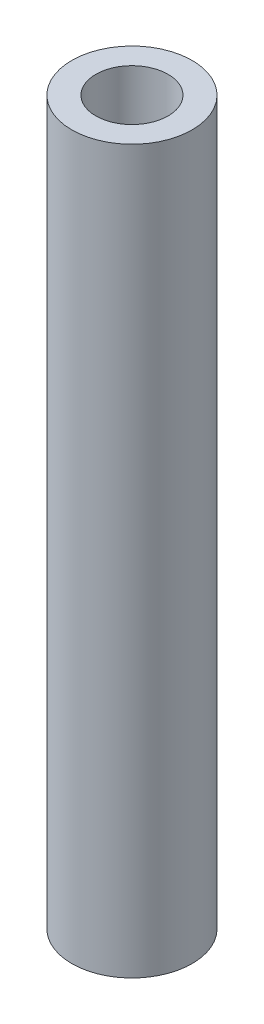
ISO-10303-21;
HEADER;
FILE_DESCRIPTION(('STEP AP214'),'2;1');
FILE_NAME('part.step','',(''),(''),'','','');
FILE_SCHEMA(('AUTOMOTIVE_DESIGN { 1 0 10303 214 1 1 1 1 }'));
ENDSEC;
DATA;
#1=APPLICATION_CONTEXT('core data for automotive mechanical design processes');
#2=APPLICATION_PROTOCOL_DEFINITION('international standard','automotive_design',2000,#1);
#3=PRODUCT_CONTEXT('',#1,'mechanical');
#4=PRODUCT('Part','Part','',(#3));
#5=PRODUCT_RELATED_PRODUCT_CATEGORY('part','',(#4));
#6=PRODUCT_DEFINITION_FORMATION('','',#4);
#7=PRODUCT_DEFINITION_CONTEXT('part definition',#1,'design');
#8=PRODUCT_DEFINITION('design','',#6,#7);
#9=PRODUCT_DEFINITION_SHAPE('','',#8);
#10=(LENGTH_UNIT() NAMED_UNIT(*) SI_UNIT(.MILLI.,.METRE.));
#11=(NAMED_UNIT(*) PLANE_ANGLE_UNIT() SI_UNIT($,.RADIAN.));
#12=(NAMED_UNIT(*) SI_UNIT($,.STERADIAN.) SOLID_ANGLE_UNIT());
#13=UNCERTAINTY_MEASURE_WITH_UNIT(LENGTH_MEASURE(1.E-05),#10,'distance_accuracy_value','');
#14=(GEOMETRIC_REPRESENTATION_CONTEXT(3) GLOBAL_UNCERTAINTY_ASSIGNED_CONTEXT((#13)) GLOBAL_UNIT_ASSIGNED_CONTEXT((#10,
#11,#12)) REPRESENTATION_CONTEXT('',''));
#15=CARTESIAN_POINT('',(0.,0.,0.));
#16=DIRECTION('',(0.,0.,1.));
#17=DIRECTION('',(1.,0.,0.));
#18=AXIS2_PLACEMENT_3D('',#15,#16,#17);
#19=CARTESIAN_POINT('',(0.,30.,0.));
#20=DIRECTION('',(0.,1.,0.));
#21=DIRECTION('',(0.,0.,1.));
#22=AXIS2_PLACEMENT_3D('',#19,#20,#21);
#23=PLANE('',#22);
#24=CARTESIAN_POINT('',(0.,30.,0.));
#25=DIRECTION('',(0.,1.,0.));
#26=DIRECTION('',(0.,0.,1.));
#27=AXIS2_PLACEMENT_3D('',#24,#25,#26);
#28=CIRCLE('',#27,2.5);
#29=CARTESIAN_POINT('',(0.,30.,2.5));
#30=VERTEX_POINT('',#29);
#31=EDGE_CURVE('E10',#30,#30,#28,.T.);
#32=ORIENTED_EDGE('',*,*,#31,.T.);
#33=EDGE_LOOP('',(#32));
#34=FACE_BOUND('',#33,.T.);
#35=CARTESIAN_POINT('',(0.,30.,0.));
#36=DIRECTION('',(0.,1.,0.));
#37=DIRECTION('',(0.,0.,1.));
#38=AXIS2_PLACEMENT_3D('',#35,#36,#37);
#39=CIRCLE('',#38,1.5);
#40=CARTESIAN_POINT('',(0.,30.,1.5));
#41=VERTEX_POINT('',#40);
#42=EDGE_CURVE('E43',#41,#41,#39,.T.);
#43=ORIENTED_EDGE('',*,*,#42,.F.);
#44=EDGE_LOOP('',(#43));
#45=FACE_BOUND('',#44,.T.);
#46=ADVANCED_FACE('F32',(#34,#45),#23,.T.);
#47=CARTESIAN_POINT('',(0.,0.,0.));
#48=DIRECTION('',(0.,1.,0.));
#49=DIRECTION('',(0.,0.,1.));
#50=AXIS2_PLACEMENT_3D('',#47,#48,#49);
#51=PLANE('',#50);
#52=CARTESIAN_POINT('',(0.,0.,0.));
#53=DIRECTION('',(0.,1.,0.));
#54=DIRECTION('',(0.,0.,1.));
#55=AXIS2_PLACEMENT_3D('',#52,#53,#54);
#56=CIRCLE('',#55,2.5);
#57=CARTESIAN_POINT('',(0.,0.,2.5));
#58=VERTEX_POINT('',#57);
#59=EDGE_CURVE('E36',#58,#58,#56,.T.);
#60=ORIENTED_EDGE('',*,*,#59,.F.);
#61=EDGE_LOOP('',(#60));
#62=FACE_BOUND('',#61,.T.);
#63=CARTESIAN_POINT('',(0.,0.,0.));
#64=DIRECTION('',(0.,1.,0.));
#65=DIRECTION('',(0.,0.,1.));
#66=AXIS2_PLACEMENT_3D('',#63,#64,#65);
#67=CIRCLE('',#66,1.5);
#68=CARTESIAN_POINT('',(0.,0.,1.5));
#69=VERTEX_POINT('',#68);
#70=EDGE_CURVE('E45',#69,#69,#67,.T.);
#71=ORIENTED_EDGE('',*,*,#70,.T.);
#72=EDGE_LOOP('',(#71));
#73=FACE_BOUND('',#72,.T.);
#74=ADVANCED_FACE('F55',(#62,#73),#51,.F.);
#75=CARTESIAN_POINT('',(0.,30.,0.));
#76=DIRECTION('',(0.,-1.,0.));
#77=DIRECTION('',(0.,0.,-1.));
#78=AXIS2_PLACEMENT_3D('',#75,#76,#77);
#79=CYLINDRICAL_SURFACE('',#78,2.5);
#80=ORIENTED_EDGE('',*,*,#31,.F.);
#81=EDGE_LOOP('',(#80));
#82=FACE_BOUND('',#81,.T.);
#83=ORIENTED_EDGE('',*,*,#59,.T.);
#84=EDGE_LOOP('',(#83));
#85=FACE_BOUND('',#84,.T.);
#86=ADVANCED_FACE('F34',(#82,#85),#79,.T.);
#87=CARTESIAN_POINT('',(0.,30.,0.));
#88=DIRECTION('',(0.,-1.,0.));
#89=DIRECTION('',(0.,0.,-1.));
#90=AXIS2_PLACEMENT_3D('',#87,#88,#89);
#91=CYLINDRICAL_SURFACE('',#90,1.5);
#92=ORIENTED_EDGE('',*,*,#42,.T.);
#93=EDGE_LOOP('',(#92));
#94=FACE_BOUND('',#93,.T.);
#95=ORIENTED_EDGE('',*,*,#70,.F.);
#96=EDGE_LOOP('',(#95));
#97=FACE_BOUND('',#96,.T.);
#98=ADVANCED_FACE('F51',(#94,#97),#91,.F.);
#99=CLOSED_SHELL('',(#46,#74,#86,#98));
#100=MANIFOLD_SOLID_BREP('B2',#99);
#101=ADVANCED_BREP_SHAPE_REPRESENTATION('',(#18,#100),#14);
#102=SHAPE_DEFINITION_REPRESENTATION(#9,#101);
ENDSEC;
END-ISO-10303-21;
